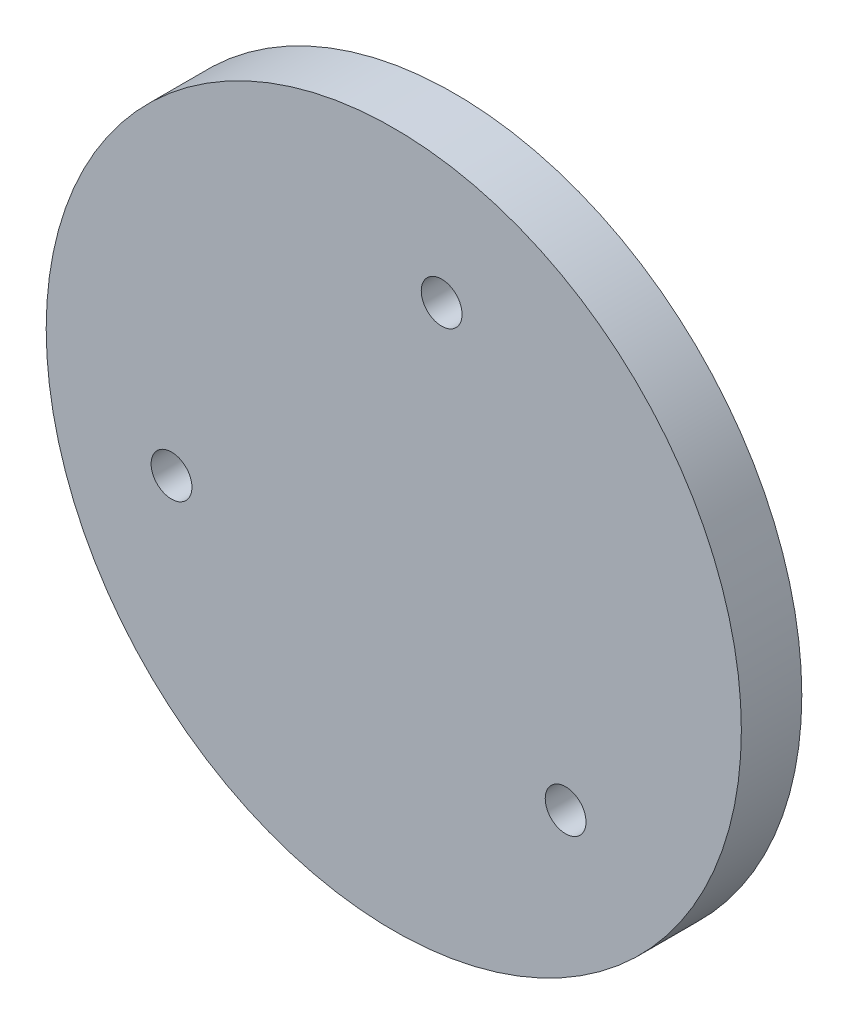
ISO-10303-21;
HEADER;
FILE_DESCRIPTION(('STEP AP214'),'2;1');
FILE_NAME('part.step','',(''),(''),'','','');
FILE_SCHEMA(('AUTOMOTIVE_DESIGN { 1 0 10303 214 1 1 1 1 }'));
ENDSEC;
DATA;
#1=APPLICATION_CONTEXT('core data for automotive mechanical design processes');
#2=APPLICATION_PROTOCOL_DEFINITION('international standard','automotive_design',2000,#1);
#3=PRODUCT_CONTEXT('',#1,'mechanical');
#4=PRODUCT('Part','Part','',(#3));
#5=PRODUCT_RELATED_PRODUCT_CATEGORY('part','',(#4));
#6=PRODUCT_DEFINITION_FORMATION('','',#4);
#7=PRODUCT_DEFINITION_CONTEXT('part definition',#1,'design');
#8=PRODUCT_DEFINITION('design','',#6,#7);
#9=PRODUCT_DEFINITION_SHAPE('','',#8);
#10=(LENGTH_UNIT() NAMED_UNIT(*) SI_UNIT(.MILLI.,.METRE.));
#11=(NAMED_UNIT(*) PLANE_ANGLE_UNIT() SI_UNIT($,.RADIAN.));
#12=(NAMED_UNIT(*) SI_UNIT($,.STERADIAN.) SOLID_ANGLE_UNIT());
#13=UNCERTAINTY_MEASURE_WITH_UNIT(LENGTH_MEASURE(1.E-05),#10,'distance_accuracy_value','');
#14=(GEOMETRIC_REPRESENTATION_CONTEXT(3) GLOBAL_UNCERTAINTY_ASSIGNED_CONTEXT((#13)) GLOBAL_UNIT_ASSIGNED_CONTEXT((#10,
#11,#12)) REPRESENTATION_CONTEXT('',''));
#15=CARTESIAN_POINT('',(0.,0.,0.));
#16=DIRECTION('',(0.,0.,1.));
#17=DIRECTION('',(1.,0.,0.));
#18=AXIS2_PLACEMENT_3D('',#15,#16,#17);
#19=CARTESIAN_POINT('',(0.,0.,7.5));
#20=DIRECTION('',(0.,0.,-1.));
#21=DIRECTION('',(-1.,0.,0.));
#22=AXIS2_PLACEMENT_3D('',#19,#20,#21);
#23=CYLINDRICAL_SURFACE('',#22,28.75);
#24=CARTESIAN_POINT('',(0.,0.,7.5));
#25=DIRECTION('',(0.,0.,1.));
#26=DIRECTION('',(1.,0.,0.));
#27=AXIS2_PLACEMENT_3D('',#24,#25,#26);
#28=CIRCLE('',#27,28.75);
#29=CARTESIAN_POINT('',(28.75,0.,7.5));
#30=VERTEX_POINT('',#29);
#31=EDGE_CURVE('E10',#30,#30,#28,.T.);
#32=ORIENTED_EDGE('',*,*,#31,.F.);
#33=EDGE_LOOP('',(#32));
#34=FACE_BOUND('',#33,.T.);
#35=CARTESIAN_POINT('',(0.,0.,2.5));
#36=DIRECTION('',(0.,0.,1.));
#37=DIRECTION('',(1.,0.,0.));
#38=AXIS2_PLACEMENT_3D('',#35,#36,#37);
#39=CIRCLE('',#38,28.75);
#40=CARTESIAN_POINT('',(28.75,0.,2.5));
#41=VERTEX_POINT('',#40);
#42=EDGE_CURVE('E37',#41,#41,#39,.T.);
#43=ORIENTED_EDGE('',*,*,#42,.T.);
#44=EDGE_LOOP('',(#43));
#45=FACE_BOUND('',#44,.T.);
#46=ADVANCED_FACE('F34',(#34,#45),#23,.T.);
#47=CARTESIAN_POINT('',(0.,0.,7.5));
#48=DIRECTION('',(0.,0.,1.));
#49=DIRECTION('',(1.,0.,0.));
#50=AXIS2_PLACEMENT_3D('',#47,#48,#49);
#51=PLANE('',#50);
#52=CARTESIAN_POINT('',(3.9592147087303,18.2276128297392,7.5));
#53=DIRECTION('',(0.,0.,1.));
#54=DIRECTION('',(1.,0.,0.));
#55=AXIS2_PLACEMENT_3D('',#52,#53,#54);
#56=CIRCLE('',#55,1.6875);
#57=CARTESIAN_POINT('',(5.6467147087303,18.2276128297392,7.5));
#58=VERTEX_POINT('',#57);
#59=EDGE_CURVE('E44',#58,#58,#56,.T.);
#60=ORIENTED_EDGE('',*,*,#59,.F.);
#61=EDGE_LOOP('',(#60));
#62=FACE_BOUND('',#61,.T.);
#63=CARTESIAN_POINT('',(-18.382838530308,-5.3307743372574,7.5));
#64=DIRECTION('',(0.,0.,1.));
#65=DIRECTION('',(1.,0.,0.));
#66=AXIS2_PLACEMENT_3D('',#63,#64,#65);
#67=CIRCLE('',#66,1.6875);
#68=CARTESIAN_POINT('',(-16.695338530308,-5.3307743372574,7.5));
#69=VERTEX_POINT('',#68);
#70=EDGE_CURVE('E48',#69,#69,#67,.T.);
#71=ORIENTED_EDGE('',*,*,#70,.F.);
#72=EDGE_LOOP('',(#71));
#73=FACE_BOUND('',#72,.T.);
#74=CARTESIAN_POINT('',(14.2134671841498,-13.0069898178024,7.5));
#75=DIRECTION('',(0.,0.,1.));
#76=DIRECTION('',(1.,0.,0.));
#77=AXIS2_PLACEMENT_3D('',#74,#75,#76);
#78=CIRCLE('',#77,1.68750000000001);
#79=CARTESIAN_POINT('',(15.9009671841498,-13.0069898178024,7.5));
#80=VERTEX_POINT('',#79);
#81=EDGE_CURVE('E51',#80,#80,#78,.T.);
#82=ORIENTED_EDGE('',*,*,#81,.F.);
#83=EDGE_LOOP('',(#82));
#84=FACE_BOUND('',#83,.T.);
#85=ORIENTED_EDGE('',*,*,#31,.T.);
#86=EDGE_LOOP('',(#85));
#87=FACE_BOUND('',#86,.T.);
#88=ADVANCED_FACE('F70',(#62,#73,#84,#87),#51,.T.);
#89=CARTESIAN_POINT('',(0.,0.,2.5));
#90=DIRECTION('',(0.,0.,1.));
#91=DIRECTION('',(1.,0.,0.));
#92=AXIS2_PLACEMENT_3D('',#89,#90,#91);
#93=PLANE('',#92);
#94=CARTESIAN_POINT('',(3.9592147087303,18.2276128297392,2.5));
#95=DIRECTION('',(0.,0.,-1.));
#96=DIRECTION('',(-1.,0.,0.));
#97=AXIS2_PLACEMENT_3D('',#94,#95,#96);
#98=CIRCLE('',#97,1.6875);
#99=CARTESIAN_POINT('',(2.27171470873029,18.2276128297392,2.5));
#100=VERTEX_POINT('',#99);
#101=EDGE_CURVE('E54',#100,#100,#98,.T.);
#102=ORIENTED_EDGE('',*,*,#101,.F.);
#103=EDGE_LOOP('',(#102));
#104=FACE_BOUND('',#103,.T.);
#105=CARTESIAN_POINT('',(-18.382838530308,-5.3307743372574,2.5));
#106=DIRECTION('',(0.,0.,-1.));
#107=DIRECTION('',(-1.,0.,0.));
#108=AXIS2_PLACEMENT_3D('',#105,#106,#107);
#109=CIRCLE('',#108,1.6875);
#110=CARTESIAN_POINT('',(-20.070338530308,-5.3307743372574,2.5));
#111=VERTEX_POINT('',#110);
#112=EDGE_CURVE('E58',#111,#111,#109,.T.);
#113=ORIENTED_EDGE('',*,*,#112,.F.);
#114=EDGE_LOOP('',(#113));
#115=FACE_BOUND('',#114,.T.);
#116=CARTESIAN_POINT('',(14.2134671841498,-13.0069898178024,2.5));
#117=DIRECTION('',(0.,0.,-1.));
#118=DIRECTION('',(-1.,0.,0.));
#119=AXIS2_PLACEMENT_3D('',#116,#117,#118);
#120=CIRCLE('',#119,1.68750000000001);
#121=CARTESIAN_POINT('',(12.5259671841498,-13.0069898178024,2.5));
#122=VERTEX_POINT('',#121);
#123=EDGE_CURVE('E55',#122,#122,#120,.T.);
#124=ORIENTED_EDGE('',*,*,#123,.F.);
#125=EDGE_LOOP('',(#124));
#126=FACE_BOUND('',#125,.T.);
#127=ORIENTED_EDGE('',*,*,#42,.F.);
#128=EDGE_LOOP('',(#127));
#129=FACE_BOUND('',#128,.T.);
#130=ADVANCED_FACE('F66',(#104,#115,#126,#129),#93,.F.);
#131=CARTESIAN_POINT('',(14.2134671841498,-13.0069898178024,12.5));
#132=DIRECTION('',(0.,0.,-1.));
#133=DIRECTION('',(-1.,0.,0.));
#134=AXIS2_PLACEMENT_3D('',#131,#132,#133);
#135=CYLINDRICAL_SURFACE('',#134,1.68750000000001);
#136=ORIENTED_EDGE('',*,*,#81,.T.);
#137=EDGE_LOOP('',(#136));
#138=FACE_BOUND('',#137,.T.);
#139=ORIENTED_EDGE('',*,*,#123,.T.);
#140=EDGE_LOOP('',(#139));
#141=FACE_BOUND('',#140,.T.);
#142=ADVANCED_FACE('F69',(#138,#141),#135,.F.);
#143=CARTESIAN_POINT('',(-18.382838530308,-5.3307743372574,12.5));
#144=DIRECTION('',(0.,0.,-1.));
#145=DIRECTION('',(-1.,0.,0.));
#146=AXIS2_PLACEMENT_3D('',#143,#144,#145);
#147=CYLINDRICAL_SURFACE('',#146,1.6875);
#148=ORIENTED_EDGE('',*,*,#70,.T.);
#149=EDGE_LOOP('',(#148));
#150=FACE_BOUND('',#149,.T.);
#151=ORIENTED_EDGE('',*,*,#112,.T.);
#152=EDGE_LOOP('',(#151));
#153=FACE_BOUND('',#152,.T.);
#154=ADVANCED_FACE('F91',(#150,#153),#147,.F.);
#155=CARTESIAN_POINT('',(3.9592147087303,18.2276128297392,12.5));
#156=DIRECTION('',(0.,0.,-1.));
#157=DIRECTION('',(-1.,0.,0.));
#158=AXIS2_PLACEMENT_3D('',#155,#156,#157);
#159=CYLINDRICAL_SURFACE('',#158,1.6875);
#160=ORIENTED_EDGE('',*,*,#59,.T.);
#161=EDGE_LOOP('',(#160));
#162=FACE_BOUND('',#161,.T.);
#163=ORIENTED_EDGE('',*,*,#101,.T.);
#164=EDGE_LOOP('',(#163));
#165=FACE_BOUND('',#164,.T.);
#166=ADVANCED_FACE('F64',(#162,#165),#159,.F.);
#167=CLOSED_SHELL('',(#46,#88,#130,#142,#154,#166));
#168=MANIFOLD_SOLID_BREP('B2',#167);
#169=ADVANCED_BREP_SHAPE_REPRESENTATION('',(#18,#168),#14);
#170=SHAPE_DEFINITION_REPRESENTATION(#9,#169);
ENDSEC;
END-ISO-10303-21;
